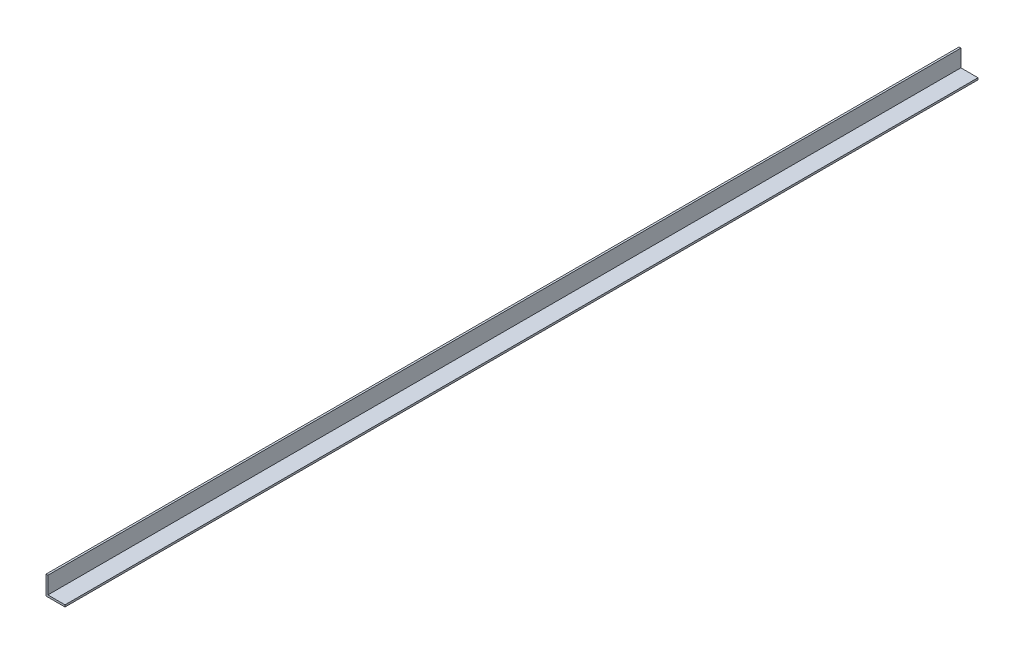
ISO-10303-21;
HEADER;
FILE_DESCRIPTION(('STEP AP214'),'2;1');
FILE_NAME('part.step','',(''),(''),'','','');
FILE_SCHEMA(('AUTOMOTIVE_DESIGN { 1 0 10303 214 1 1 1 1 }'));
ENDSEC;
DATA;
#1=APPLICATION_CONTEXT('core data for automotive mechanical design processes');
#2=APPLICATION_PROTOCOL_DEFINITION('international standard','automotive_design',2000,#1);
#3=PRODUCT_CONTEXT('',#1,'mechanical');
#4=PRODUCT('Part','Part','',(#3));
#5=PRODUCT_RELATED_PRODUCT_CATEGORY('part','',(#4));
#6=PRODUCT_DEFINITION_FORMATION('','',#4);
#7=PRODUCT_DEFINITION_CONTEXT('part definition',#1,'design');
#8=PRODUCT_DEFINITION('design','',#6,#7);
#9=PRODUCT_DEFINITION_SHAPE('','',#8);
#10=(LENGTH_UNIT() NAMED_UNIT(*) SI_UNIT(.MILLI.,.METRE.));
#11=(NAMED_UNIT(*) PLANE_ANGLE_UNIT() SI_UNIT($,.RADIAN.));
#12=(NAMED_UNIT(*) SI_UNIT($,.STERADIAN.) SOLID_ANGLE_UNIT());
#13=UNCERTAINTY_MEASURE_WITH_UNIT(LENGTH_MEASURE(1.E-05),#10,'distance_accuracy_value','');
#14=(GEOMETRIC_REPRESENTATION_CONTEXT(3) GLOBAL_UNCERTAINTY_ASSIGNED_CONTEXT((#13)) GLOBAL_UNIT_ASSIGNED_CONTEXT((#10,
#11,#12)) REPRESENTATION_CONTEXT('',''));
#15=CARTESIAN_POINT('',(0.,0.,0.));
#16=DIRECTION('',(0.,0.,1.));
#17=DIRECTION('',(1.,0.,0.));
#18=AXIS2_PLACEMENT_3D('',#15,#16,#17);
#19=CARTESIAN_POINT('',(12.7,127.,-6100.));
#20=DIRECTION('',(0.,1.,0.));
#21=DIRECTION('',(0.,0.,1.));
#22=AXIS2_PLACEMENT_3D('',#19,#20,#21);
#23=PLANE('',#22);
#24=DIRECTION('',(-1.,0.,0.));
#25=VECTOR('',#24,1.);
#26=CARTESIAN_POINT('',(12.7,127.,0.));
#27=LINE('',#26,#25);
#28=CARTESIAN_POINT('',(12.7,127.,0.));
#29=VERTEX_POINT('',#28);
#30=CARTESIAN_POINT('',(0.,127.,0.));
#31=VERTEX_POINT('',#30);
#32=EDGE_CURVE('E118',#29,#31,#27,.T.);
#33=ORIENTED_EDGE('',*,*,#32,.F.);
#34=DIRECTION('',(0.,0.,1.));
#35=VECTOR('',#34,1.);
#36=CARTESIAN_POINT('',(12.7,127.,-6100.));
#37=LINE('',#36,#35);
#38=CARTESIAN_POINT('',(12.7,127.,-6100.));
#39=VERTEX_POINT('',#38);
#40=EDGE_CURVE('E11',#39,#29,#37,.T.);
#41=ORIENTED_EDGE('',*,*,#40,.F.);
#42=DIRECTION('',(-1.,0.,0.));
#43=VECTOR('',#42,1.);
#44=CARTESIAN_POINT('',(12.7,127.,-6100.));
#45=LINE('',#44,#43);
#46=CARTESIAN_POINT('',(0.,127.,-6100.));
#47=VERTEX_POINT('',#46);
#48=EDGE_CURVE('E132',#39,#47,#45,.T.);
#49=ORIENTED_EDGE('',*,*,#48,.T.);
#50=DIRECTION('',(0.,0.,1.));
#51=VECTOR('',#50,1.);
#52=CARTESIAN_POINT('',(0.,127.,-6100.));
#53=LINE('',#52,#51);
#54=EDGE_CURVE('E36',#47,#31,#53,.T.);
#55=ORIENTED_EDGE('',*,*,#54,.T.);
#56=EDGE_LOOP('',(#33,#41,#49,#55));
#57=FACE_BOUND('',#56,.T.);
#58=ADVANCED_FACE('F33',(#57),#23,.T.);
#59=CARTESIAN_POINT('',(12.7,12.7,-6100.));
#60=DIRECTION('',(1.,0.,0.));
#61=DIRECTION('',(0.,1.,0.));
#62=AXIS2_PLACEMENT_3D('',#59,#60,#61);
#63=PLANE('',#62);
#64=DIRECTION('',(0.,1.,0.));
#65=VECTOR('',#64,1.);
#66=CARTESIAN_POINT('',(12.7,12.7,0.));
#67=LINE('',#66,#65);
#68=CARTESIAN_POINT('',(12.7,12.7,0.));
#69=VERTEX_POINT('',#68);
#70=EDGE_CURVE('E130',#69,#29,#67,.T.);
#71=ORIENTED_EDGE('',*,*,#70,.F.);
#72=DIRECTION('',(0.,0.,1.));
#73=VECTOR('',#72,1.);
#74=CARTESIAN_POINT('',(12.7,12.7,-6100.));
#75=LINE('',#74,#73);
#76=CARTESIAN_POINT('',(12.7,12.7,-6100.));
#77=VERTEX_POINT('',#76);
#78=EDGE_CURVE('E42',#77,#69,#75,.T.);
#79=ORIENTED_EDGE('',*,*,#78,.F.);
#80=DIRECTION('',(0.,1.,0.));
#81=VECTOR('',#80,1.);
#82=CARTESIAN_POINT('',(12.7,12.7,-6100.));
#83=LINE('',#82,#81);
#84=EDGE_CURVE('E108',#77,#39,#83,.T.);
#85=ORIENTED_EDGE('',*,*,#84,.T.);
#86=ORIENTED_EDGE('',*,*,#40,.T.);
#87=EDGE_LOOP('',(#71,#79,#85,#86));
#88=FACE_BOUND('',#87,.T.);
#89=ADVANCED_FACE('F140',(#88),#63,.T.);
#90=CARTESIAN_POINT('',(127.,12.7,-6100.));
#91=DIRECTION('',(0.,1.,0.));
#92=DIRECTION('',(-1.,0.,0.));
#93=AXIS2_PLACEMENT_3D('',#90,#91,#92);
#94=PLANE('',#93);
#95=DIRECTION('',(-1.,0.,0.));
#96=VECTOR('',#95,1.);
#97=CARTESIAN_POINT('',(127.,12.7,0.));
#98=LINE('',#97,#96);
#99=CARTESIAN_POINT('',(127.,12.7,0.));
#100=VERTEX_POINT('',#99);
#101=EDGE_CURVE('E95',#100,#69,#98,.T.);
#102=ORIENTED_EDGE('',*,*,#101,.F.);
#103=DIRECTION('',(0.,0.,1.));
#104=VECTOR('',#103,1.);
#105=CARTESIAN_POINT('',(127.,12.7,-6100.));
#106=LINE('',#105,#104);
#107=CARTESIAN_POINT('',(127.,12.7,-6100.));
#108=VERTEX_POINT('',#107);
#109=EDGE_CURVE('E90',#108,#100,#106,.T.);
#110=ORIENTED_EDGE('',*,*,#109,.F.);
#111=DIRECTION('',(-1.,0.,0.));
#112=VECTOR('',#111,1.);
#113=CARTESIAN_POINT('',(127.,12.7,-6100.));
#114=LINE('',#113,#112);
#115=EDGE_CURVE('E93',#108,#77,#114,.T.);
#116=ORIENTED_EDGE('',*,*,#115,.T.);
#117=ORIENTED_EDGE('',*,*,#78,.T.);
#118=EDGE_LOOP('',(#102,#110,#116,#117));
#119=FACE_BOUND('',#118,.T.);
#120=ADVANCED_FACE('F92',(#119),#94,.T.);
#121=CARTESIAN_POINT('',(127.,0.,-6100.));
#122=DIRECTION('',(1.,0.,0.));
#123=DIRECTION('',(0.,0.,-1.));
#124=AXIS2_PLACEMENT_3D('',#121,#122,#123);
#125=PLANE('',#124);
#126=DIRECTION('',(0.,1.,0.));
#127=VECTOR('',#126,1.);
#128=CARTESIAN_POINT('',(127.,0.,0.));
#129=LINE('',#128,#127);
#130=CARTESIAN_POINT('',(127.,0.,0.));
#131=VERTEX_POINT('',#130);
#132=EDGE_CURVE('E127',#131,#100,#129,.T.);
#133=ORIENTED_EDGE('',*,*,#132,.F.);
#134=DIRECTION('',(0.,0.,1.));
#135=VECTOR('',#134,1.);
#136=CARTESIAN_POINT('',(127.,0.,-6100.));
#137=LINE('',#136,#135);
#138=CARTESIAN_POINT('',(127.,0.,-6100.));
#139=VERTEX_POINT('',#138);
#140=EDGE_CURVE('E100',#139,#131,#137,.T.);
#141=ORIENTED_EDGE('',*,*,#140,.F.);
#142=DIRECTION('',(0.,1.,0.));
#143=VECTOR('',#142,1.);
#144=CARTESIAN_POINT('',(127.,0.,-6100.));
#145=LINE('',#144,#143);
#146=EDGE_CURVE('E106',#139,#108,#145,.T.);
#147=ORIENTED_EDGE('',*,*,#146,.T.);
#148=ORIENTED_EDGE('',*,*,#109,.T.);
#149=EDGE_LOOP('',(#133,#141,#147,#148));
#150=FACE_BOUND('',#149,.T.);
#151=ADVANCED_FACE('F110',(#150),#125,.T.);
#152=CARTESIAN_POINT('',(0.,0.,-6100.));
#153=DIRECTION('',(0.,-1.,0.));
#154=DIRECTION('',(0.,0.,-1.));
#155=AXIS2_PLACEMENT_3D('',#152,#153,#154);
#156=PLANE('',#155);
#157=DIRECTION('',(1.,0.,0.));
#158=VECTOR('',#157,1.);
#159=CARTESIAN_POINT('',(0.,0.,0.));
#160=LINE('',#159,#158);
#161=CARTESIAN_POINT('',(0.,0.,0.));
#162=VERTEX_POINT('',#161);
#163=EDGE_CURVE('E124',#162,#131,#160,.T.);
#164=ORIENTED_EDGE('',*,*,#163,.F.);
#165=DIRECTION('',(0.,0.,1.));
#166=VECTOR('',#165,1.);
#167=CARTESIAN_POINT('',(0.,0.,-6100.));
#168=LINE('',#167,#166);
#169=CARTESIAN_POINT('',(0.,0.,-6100.));
#170=VERTEX_POINT('',#169);
#171=EDGE_CURVE('E135',#170,#162,#168,.T.);
#172=ORIENTED_EDGE('',*,*,#171,.F.);
#173=DIRECTION('',(1.,0.,0.));
#174=VECTOR('',#173,1.);
#175=CARTESIAN_POINT('',(0.,0.,-6100.));
#176=LINE('',#175,#174);
#177=EDGE_CURVE('E111',#170,#139,#176,.T.);
#178=ORIENTED_EDGE('',*,*,#177,.T.);
#179=ORIENTED_EDGE('',*,*,#140,.T.);
#180=EDGE_LOOP('',(#164,#172,#178,#179));
#181=FACE_BOUND('',#180,.T.);
#182=ADVANCED_FACE('F153',(#181),#156,.T.);
#183=CARTESIAN_POINT('',(0.,127.,-6100.));
#184=DIRECTION('',(-1.,0.,0.));
#185=DIRECTION('',(0.,-1.,0.));
#186=AXIS2_PLACEMENT_3D('',#183,#184,#185);
#187=PLANE('',#186);
#188=DIRECTION('',(0.,-1.,0.));
#189=VECTOR('',#188,1.);
#190=CARTESIAN_POINT('',(0.,127.,0.));
#191=LINE('',#190,#189);
#192=EDGE_CURVE('E121',#31,#162,#191,.T.);
#193=ORIENTED_EDGE('',*,*,#192,.F.);
#194=ORIENTED_EDGE('',*,*,#54,.F.);
#195=DIRECTION('',(0.,-1.,0.));
#196=VECTOR('',#195,1.);
#197=CARTESIAN_POINT('',(0.,127.,-6100.));
#198=LINE('',#197,#196);
#199=EDGE_CURVE('E113',#47,#170,#198,.T.);
#200=ORIENTED_EDGE('',*,*,#199,.T.);
#201=ORIENTED_EDGE('',*,*,#171,.T.);
#202=EDGE_LOOP('',(#193,#194,#200,#201));
#203=FACE_BOUND('',#202,.T.);
#204=ADVANCED_FACE('F137',(#203),#187,.T.);
#205=CARTESIAN_POINT('',(0.,0.,-6100.));
#206=DIRECTION('',(0.,0.,1.));
#207=DIRECTION('',(1.,0.,0.));
#208=AXIS2_PLACEMENT_3D('',#205,#206,#207);
#209=PLANE('',#208);
#210=ORIENTED_EDGE('',*,*,#48,.F.);
#211=ORIENTED_EDGE('',*,*,#84,.F.);
#212=ORIENTED_EDGE('',*,*,#115,.F.);
#213=ORIENTED_EDGE('',*,*,#146,.F.);
#214=ORIENTED_EDGE('',*,*,#177,.F.);
#215=ORIENTED_EDGE('',*,*,#199,.F.);
#216=EDGE_LOOP('',(#210,#211,#212,#213,#214,#215));
#217=FACE_BOUND('',#216,.T.);
#218=ADVANCED_FACE('F104',(#217),#209,.F.);
#219=CARTESIAN_POINT('',(0.,0.,0.));
#220=DIRECTION('',(0.,0.,1.));
#221=DIRECTION('',(1.,0.,0.));
#222=AXIS2_PLACEMENT_3D('',#219,#220,#221);
#223=PLANE('',#222);
#224=ORIENTED_EDGE('',*,*,#32,.T.);
#225=ORIENTED_EDGE('',*,*,#192,.T.);
#226=ORIENTED_EDGE('',*,*,#163,.T.);
#227=ORIENTED_EDGE('',*,*,#132,.T.);
#228=ORIENTED_EDGE('',*,*,#101,.T.);
#229=ORIENTED_EDGE('',*,*,#70,.T.);
#230=EDGE_LOOP('',(#224,#225,#226,#227,#228,#229));
#231=FACE_BOUND('',#230,.T.);
#232=ADVANCED_FACE('F139',(#231),#223,.T.);
#233=CLOSED_SHELL('',(#58,#89,#120,#151,#182,#204,#218,#232));
#234=MANIFOLD_SOLID_BREP('B2',#233);
#235=ADVANCED_BREP_SHAPE_REPRESENTATION('',(#18,#234),#14);
#236=SHAPE_DEFINITION_REPRESENTATION(#9,#235);
ENDSEC;
END-ISO-10303-21;
